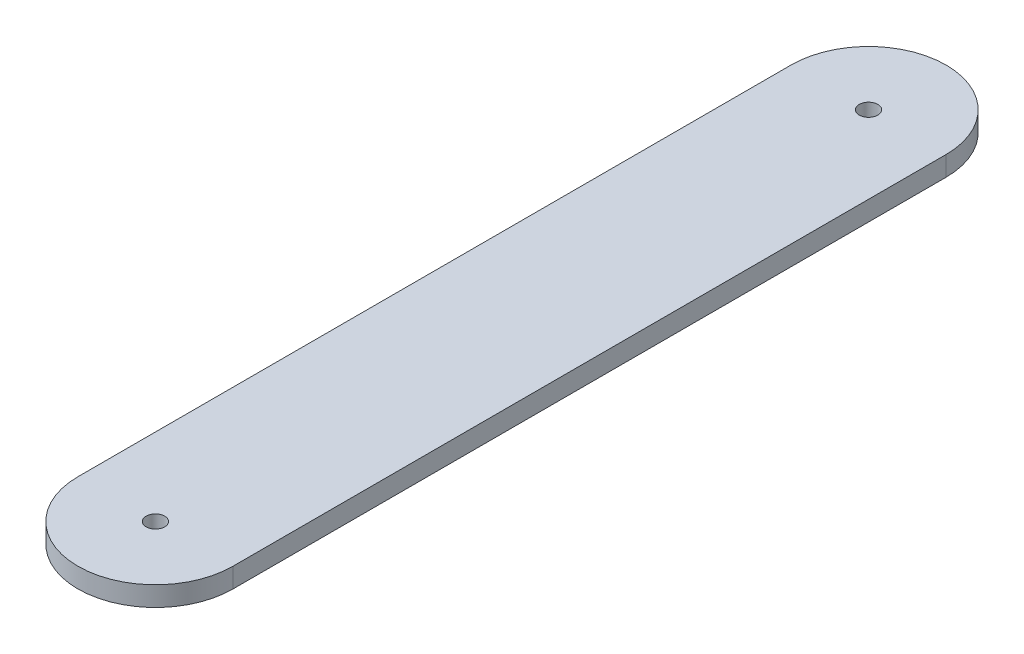
ISO-10303-21;
HEADER;
FILE_DESCRIPTION(('STEP AP214'),'2;1');
FILE_NAME('part.step','',(''),(''),'','','');
FILE_SCHEMA(('AUTOMOTIVE_DESIGN { 1 0 10303 214 1 1 1 1 }'));
ENDSEC;
DATA;
#1=APPLICATION_CONTEXT('core data for automotive mechanical design processes');
#2=APPLICATION_PROTOCOL_DEFINITION('international standard','automotive_design',2000,#1);
#3=PRODUCT_CONTEXT('',#1,'mechanical');
#4=PRODUCT('Part','Part','',(#3));
#5=PRODUCT_RELATED_PRODUCT_CATEGORY('part','',(#4));
#6=PRODUCT_DEFINITION_FORMATION('','',#4);
#7=PRODUCT_DEFINITION_CONTEXT('part definition',#1,'design');
#8=PRODUCT_DEFINITION('design','',#6,#7);
#9=PRODUCT_DEFINITION_SHAPE('','',#8);
#10=(LENGTH_UNIT() NAMED_UNIT(*) SI_UNIT(.MILLI.,.METRE.));
#11=(NAMED_UNIT(*) PLANE_ANGLE_UNIT() SI_UNIT($,.RADIAN.));
#12=(NAMED_UNIT(*) SI_UNIT($,.STERADIAN.) SOLID_ANGLE_UNIT());
#13=UNCERTAINTY_MEASURE_WITH_UNIT(LENGTH_MEASURE(1.E-05),#10,'distance_accuracy_value','');
#14=(GEOMETRIC_REPRESENTATION_CONTEXT(3) GLOBAL_UNCERTAINTY_ASSIGNED_CONTEXT((#13)) GLOBAL_UNIT_ASSIGNED_CONTEXT((#10,
#11,#12)) REPRESENTATION_CONTEXT('',''));
#15=CARTESIAN_POINT('',(0.,0.,0.));
#16=DIRECTION('',(0.,0.,1.));
#17=DIRECTION('',(1.,0.,0.));
#18=AXIS2_PLACEMENT_3D('',#15,#16,#17);
#19=CARTESIAN_POINT('',(0.,3.18,0.));
#20=DIRECTION('',(0.,-1.,0.));
#21=DIRECTION('',(0.,0.,-1.));
#22=AXIS2_PLACEMENT_3D('',#19,#20,#21);
#23=PLANE('',#22);
#24=CARTESIAN_POINT('',(0.,3.18,0.));
#25=DIRECTION('',(0.,1.,0.));
#26=DIRECTION('',(0.,0.,-1.));
#27=AXIS2_PLACEMENT_3D('',#24,#25,#26);
#28=CIRCLE('',#27,12.5);
#29=CARTESIAN_POINT('',(-12.5,3.18,0.));
#30=VERTEX_POINT('',#29);
#31=CARTESIAN_POINT('',(12.5,3.18,0.));
#32=VERTEX_POINT('',#31);
#33=EDGE_CURVE('E85',#30,#32,#28,.T.);
#34=ORIENTED_EDGE('',*,*,#33,.T.);
#35=DIRECTION('',(0.,0.,-1.));
#36=VECTOR('',#35,1.);
#37=CARTESIAN_POINT('',(12.5,3.18,0.));
#38=LINE('',#37,#36);
#39=CARTESIAN_POINT('',(12.5,3.18,-115.));
#40=VERTEX_POINT('',#39);
#41=EDGE_CURVE('E80',#32,#40,#38,.T.);
#42=ORIENTED_EDGE('',*,*,#41,.T.);
#43=CARTESIAN_POINT('',(0.,3.18,-115.));
#44=DIRECTION('',(0.,1.,0.));
#45=DIRECTION('',(0.,0.,-1.));
#46=AXIS2_PLACEMENT_3D('',#43,#44,#45);
#47=CIRCLE('',#46,12.5);
#48=CARTESIAN_POINT('',(-12.5,3.18,-115.));
#49=VERTEX_POINT('',#48);
#50=EDGE_CURVE('E83',#40,#49,#47,.T.);
#51=ORIENTED_EDGE('',*,*,#50,.T.);
#52=DIRECTION('',(0.,0.,1.));
#53=VECTOR('',#52,1.);
#54=CARTESIAN_POINT('',(-12.5,3.18,0.));
#55=LINE('',#54,#53);
#56=EDGE_CURVE('E50',#49,#30,#55,.T.);
#57=ORIENTED_EDGE('',*,*,#56,.T.);
#58=EDGE_LOOP('',(#34,#42,#51,#57));
#59=FACE_BOUND('',#58,.T.);
#60=CARTESIAN_POINT('',(0.,3.18,-115.));
#61=DIRECTION('',(0.,1.,0.));
#62=DIRECTION('',(0.,0.,1.));
#63=AXIS2_PLACEMENT_3D('',#60,#61,#62);
#64=CIRCLE('',#63,1.5);
#65=CARTESIAN_POINT('',(0.,3.18,-116.5));
#66=VERTEX_POINT('',#65);
#67=EDGE_CURVE('E100',#66,#66,#64,.T.);
#68=ORIENTED_EDGE('',*,*,#67,.F.);
#69=EDGE_LOOP('',(#68));
#70=FACE_BOUND('',#69,.T.);
#71=CARTESIAN_POINT('',(0.,3.18,0.));
#72=DIRECTION('',(0.,1.,0.));
#73=DIRECTION('',(0.,0.,1.));
#74=AXIS2_PLACEMENT_3D('',#71,#72,#73);
#75=CIRCLE('',#74,1.5);
#76=CARTESIAN_POINT('',(0.,3.18,-1.5));
#77=VERTEX_POINT('',#76);
#78=EDGE_CURVE('E115',#77,#77,#75,.T.);
#79=ORIENTED_EDGE('',*,*,#78,.F.);
#80=EDGE_LOOP('',(#79));
#81=FACE_BOUND('',#80,.T.);
#82=ADVANCED_FACE('F33',(#59,#70,#81),#23,.F.);
#83=CARTESIAN_POINT('',(0.,0.,0.));
#84=DIRECTION('',(0.,-1.,0.));
#85=DIRECTION('',(0.,0.,-1.));
#86=AXIS2_PLACEMENT_3D('',#83,#84,#85);
#87=PLANE('',#86);
#88=CARTESIAN_POINT('',(0.,0.,-115.));
#89=DIRECTION('',(0.,1.,0.));
#90=DIRECTION('',(0.,0.,1.));
#91=AXIS2_PLACEMENT_3D('',#88,#89,#90);
#92=CIRCLE('',#91,1.5);
#93=CARTESIAN_POINT('',(0.,0.,-116.5));
#94=VERTEX_POINT('',#93);
#95=EDGE_CURVE('E112',#94,#94,#92,.T.);
#96=ORIENTED_EDGE('',*,*,#95,.T.);
#97=EDGE_LOOP('',(#96));
#98=FACE_BOUND('',#97,.T.);
#99=CARTESIAN_POINT('',(0.,0.,0.));
#100=DIRECTION('',(0.,1.,0.));
#101=DIRECTION('',(0.,0.,-1.));
#102=AXIS2_PLACEMENT_3D('',#99,#100,#101);
#103=CIRCLE('',#102,12.5);
#104=CARTESIAN_POINT('',(-12.5,0.,0.));
#105=VERTEX_POINT('',#104);
#106=CARTESIAN_POINT('',(12.5,0.,0.));
#107=VERTEX_POINT('',#106);
#108=EDGE_CURVE('E97',#105,#107,#103,.T.);
#109=ORIENTED_EDGE('',*,*,#108,.F.);
#110=DIRECTION('',(0.,0.,1.));
#111=VECTOR('',#110,1.);
#112=CARTESIAN_POINT('',(-12.5,0.,0.));
#113=LINE('',#112,#111);
#114=CARTESIAN_POINT('',(-12.5,0.,-115.));
#115=VERTEX_POINT('',#114);
#116=EDGE_CURVE('E73',#115,#105,#113,.T.);
#117=ORIENTED_EDGE('',*,*,#116,.F.);
#118=CARTESIAN_POINT('',(0.,0.,-115.));
#119=DIRECTION('',(0.,1.,0.));
#120=DIRECTION('',(0.,0.,-1.));
#121=AXIS2_PLACEMENT_3D('',#118,#119,#120);
#122=CIRCLE('',#121,12.5);
#123=CARTESIAN_POINT('',(12.5,0.,-115.));
#124=VERTEX_POINT('',#123);
#125=EDGE_CURVE('E67',#124,#115,#122,.T.);
#126=ORIENTED_EDGE('',*,*,#125,.F.);
#127=DIRECTION('',(0.,0.,-1.));
#128=VECTOR('',#127,1.);
#129=CARTESIAN_POINT('',(12.5,0.,0.));
#130=LINE('',#129,#128);
#131=EDGE_CURVE('E89',#107,#124,#130,.T.);
#132=ORIENTED_EDGE('',*,*,#131,.F.);
#133=EDGE_LOOP('',(#109,#117,#126,#132));
#134=FACE_BOUND('',#133,.T.);
#135=CARTESIAN_POINT('',(0.,0.,0.));
#136=DIRECTION('',(0.,1.,0.));
#137=DIRECTION('',(0.,0.,1.));
#138=AXIS2_PLACEMENT_3D('',#135,#136,#137);
#139=CIRCLE('',#138,1.5);
#140=CARTESIAN_POINT('',(0.,0.,-1.5));
#141=VERTEX_POINT('',#140);
#142=EDGE_CURVE('E118',#141,#141,#139,.T.);
#143=ORIENTED_EDGE('',*,*,#142,.T.);
#144=EDGE_LOOP('',(#143));
#145=FACE_BOUND('',#144,.T.);
#146=ADVANCED_FACE('F108',(#98,#134,#145),#87,.T.);
#147=CARTESIAN_POINT('',(0.,3.18,0.));
#148=DIRECTION('',(0.,-1.,0.));
#149=DIRECTION('',(0.,0.,-1.));
#150=AXIS2_PLACEMENT_3D('',#147,#148,#149);
#151=CYLINDRICAL_SURFACE('',#150,12.5);
#152=ORIENTED_EDGE('',*,*,#108,.T.);
#153=DIRECTION('',(0.,-1.,0.));
#154=VECTOR('',#153,1.);
#155=CARTESIAN_POINT('',(12.5,3.18,0.));
#156=LINE('',#155,#154);
#157=EDGE_CURVE('E11',#32,#107,#156,.T.);
#158=ORIENTED_EDGE('',*,*,#157,.F.);
#159=ORIENTED_EDGE('',*,*,#33,.F.);
#160=DIRECTION('',(0.,-1.,0.));
#161=VECTOR('',#160,1.);
#162=CARTESIAN_POINT('',(-12.5,3.18,0.));
#163=LINE('',#162,#161);
#164=EDGE_CURVE('E93',#30,#105,#163,.T.);
#165=ORIENTED_EDGE('',*,*,#164,.T.);
#166=EDGE_LOOP('',(#152,#158,#159,#165));
#167=FACE_BOUND('',#166,.T.);
#168=ADVANCED_FACE('F35',(#167),#151,.T.);
#169=CARTESIAN_POINT('',(12.5,3.18,0.));
#170=DIRECTION('',(-1.,0.,0.));
#171=DIRECTION('',(0.,0.,1.));
#172=AXIS2_PLACEMENT_3D('',#169,#170,#171);
#173=PLANE('',#172);
#174=ORIENTED_EDGE('',*,*,#131,.T.);
#175=DIRECTION('',(0.,-1.,0.));
#176=VECTOR('',#175,1.);
#177=CARTESIAN_POINT('',(12.5,3.18,-115.));
#178=LINE('',#177,#176);
#179=EDGE_CURVE('E42',#40,#124,#178,.T.);
#180=ORIENTED_EDGE('',*,*,#179,.F.);
#181=ORIENTED_EDGE('',*,*,#41,.F.);
#182=ORIENTED_EDGE('',*,*,#157,.T.);
#183=EDGE_LOOP('',(#174,#180,#181,#182));
#184=FACE_BOUND('',#183,.T.);
#185=ADVANCED_FACE('F88',(#184),#173,.F.);
#186=CARTESIAN_POINT('',(0.,3.18,-115.));
#187=DIRECTION('',(0.,-1.,0.));
#188=DIRECTION('',(0.,0.,-1.));
#189=AXIS2_PLACEMENT_3D('',#186,#187,#188);
#190=CYLINDRICAL_SURFACE('',#189,12.5);
#191=ORIENTED_EDGE('',*,*,#125,.T.);
#192=DIRECTION('',(0.,-1.,0.));
#193=VECTOR('',#192,1.);
#194=CARTESIAN_POINT('',(-12.5,3.18,-115.));
#195=LINE('',#194,#193);
#196=EDGE_CURVE('E90',#49,#115,#195,.T.);
#197=ORIENTED_EDGE('',*,*,#196,.F.);
#198=ORIENTED_EDGE('',*,*,#50,.F.);
#199=ORIENTED_EDGE('',*,*,#179,.T.);
#200=EDGE_LOOP('',(#191,#197,#198,#199));
#201=FACE_BOUND('',#200,.T.);
#202=ADVANCED_FACE('F91',(#201),#190,.T.);
#203=CARTESIAN_POINT('',(-12.5,3.18,0.));
#204=DIRECTION('',(1.,0.,0.));
#205=DIRECTION('',(0.,0.,-1.));
#206=AXIS2_PLACEMENT_3D('',#203,#204,#205);
#207=PLANE('',#206);
#208=ORIENTED_EDGE('',*,*,#116,.T.);
#209=ORIENTED_EDGE('',*,*,#164,.F.);
#210=ORIENTED_EDGE('',*,*,#56,.F.);
#211=ORIENTED_EDGE('',*,*,#196,.T.);
#212=EDGE_LOOP('',(#208,#209,#210,#211));
#213=FACE_BOUND('',#212,.T.);
#214=ADVANCED_FACE('F105',(#213),#207,.F.);
#215=CARTESIAN_POINT('',(0.,3.18,-115.));
#216=DIRECTION('',(0.,-1.,0.));
#217=DIRECTION('',(0.,0.,-1.));
#218=AXIS2_PLACEMENT_3D('',#215,#216,#217);
#219=CYLINDRICAL_SURFACE('',#218,1.5);
#220=CARTESIAN_POINT('',(0.,3.18,-116.5));
#221=CARTESIAN_POINT('',(0.,3.146875,-116.5));
#222=CARTESIAN_POINT('',(0.,3.11375,-116.5));
#223=CARTESIAN_POINT('',(0.,3.0475,-116.5));
#224=CARTESIAN_POINT('',(0.,3.014375,-116.5));
#225=CARTESIAN_POINT('',(0.,2.948125,-116.5));
#226=CARTESIAN_POINT('',(0.,2.915,-116.5));
#227=CARTESIAN_POINT('',(0.,2.84875,-116.5));
#228=CARTESIAN_POINT('',(0.,2.815625,-116.5));
#229=CARTESIAN_POINT('',(0.,2.749375,-116.5));
#230=CARTESIAN_POINT('',(0.,2.71625,-116.5));
#231=CARTESIAN_POINT('',(0.,2.65,-116.5));
#232=CARTESIAN_POINT('',(0.,2.616875,-116.5));
#233=CARTESIAN_POINT('',(0.,2.550625,-116.5));
#234=CARTESIAN_POINT('',(0.,2.5175,-116.5));
#235=CARTESIAN_POINT('',(0.,2.45125,-116.5));
#236=CARTESIAN_POINT('',(0.,2.418125,-116.5));
#237=CARTESIAN_POINT('',(0.,2.351875,-116.5));
#238=CARTESIAN_POINT('',(0.,2.31875,-116.5));
#239=CARTESIAN_POINT('',(0.,2.2525,-116.5));
#240=CARTESIAN_POINT('',(0.,2.219375,-116.5));
#241=CARTESIAN_POINT('',(0.,2.153125,-116.5));
#242=CARTESIAN_POINT('',(0.,2.12,-116.5));
#243=CARTESIAN_POINT('',(0.,2.05375,-116.5));
#244=CARTESIAN_POINT('',(0.,2.020625,-116.5));
#245=CARTESIAN_POINT('',(0.,1.954375,-116.5));
#246=CARTESIAN_POINT('',(0.,1.92125,-116.5));
#247=CARTESIAN_POINT('',(0.,1.855,-116.5));
#248=CARTESIAN_POINT('',(0.,1.821875,-116.5));
#249=CARTESIAN_POINT('',(0.,1.755625,-116.5));
#250=CARTESIAN_POINT('',(0.,1.7225,-116.5));
#251=CARTESIAN_POINT('',(0.,1.65625,-116.5));
#252=CARTESIAN_POINT('',(0.,1.623125,-116.5));
#253=CARTESIAN_POINT('',(0.,1.556875,-116.5));
#254=CARTESIAN_POINT('',(0.,1.52375,-116.5));
#255=CARTESIAN_POINT('',(0.,1.4575,-116.5));
#256=CARTESIAN_POINT('',(0.,1.424375,-116.5));
#257=CARTESIAN_POINT('',(0.,1.358125,-116.5));
#258=CARTESIAN_POINT('',(0.,1.325,-116.5));
#259=CARTESIAN_POINT('',(0.,1.25875,-116.5));
#260=CARTESIAN_POINT('',(0.,1.225625,-116.5));
#261=CARTESIAN_POINT('',(0.,1.159375,-116.5));
#262=CARTESIAN_POINT('',(0.,1.12625,-116.5));
#263=CARTESIAN_POINT('',(0.,1.06,-116.5));
#264=CARTESIAN_POINT('',(0.,1.026875,-116.5));
#265=CARTESIAN_POINT('',(0.,0.960625,-116.5));
#266=CARTESIAN_POINT('',(0.,0.9275,-116.5));
#267=CARTESIAN_POINT('',(0.,0.86125,-116.5));
#268=CARTESIAN_POINT('',(0.,0.828125,-116.5));
#269=CARTESIAN_POINT('',(0.,0.761875,-116.5));
#270=CARTESIAN_POINT('',(0.,0.72875,-116.5));
#271=CARTESIAN_POINT('',(0.,0.6625,-116.5));
#272=CARTESIAN_POINT('',(0.,0.629375,-116.5));
#273=CARTESIAN_POINT('',(0.,0.563125,-116.5));
#274=CARTESIAN_POINT('',(0.,0.53,-116.5));
#275=CARTESIAN_POINT('',(0.,0.46375,-116.5));
#276=CARTESIAN_POINT('',(0.,0.430625,-116.5));
#277=CARTESIAN_POINT('',(0.,0.364375,-116.5));
#278=CARTESIAN_POINT('',(0.,0.33125,-116.5));
#279=CARTESIAN_POINT('',(0.,0.265,-116.5));
#280=CARTESIAN_POINT('',(0.,0.231875,-116.5));
#281=CARTESIAN_POINT('',(0.,0.165625,-116.5));
#282=CARTESIAN_POINT('',(0.,0.1325,-116.5));
#283=CARTESIAN_POINT('',(0.,0.06625,-116.5));
#284=CARTESIAN_POINT('',(0.,0.033125,-116.5));
#285=CARTESIAN_POINT('',(0.,0.,-116.5));
#286=B_SPLINE_CURVE_WITH_KNOTS('',3,(#220,#221,#222,#223,#224,#225,#226,#227,#228,#229,#230,
#231,#232,#233,#234,#235,#236,#237,#238,#239,#240,#241,#242,#243,#244,#245,#246,#247,#248,#249,
#250,#251,#252,#253,#254,#255,#256,#257,#258,#259,#260,#261,#262,#263,#264,#265,#266,#267,#268,
#269,#270,#271,#272,#273,#274,#275,#276,#277,#278,#279,#280,#281,#282,#283,#284,#285),
.UNSPECIFIED.,.F.,.F.,(4,2,2,2,2,2,2,2,2,2,2,2,2,2,2,2,2,2,2,2,2,2,2,2,2,2,2,2,2,2,2,2,4),(0.,
0.0993749999999996,0.19875,0.298125,0.3975,0.496875,0.59625,0.695625,0.795,0.894375,0.99375,
1.093125,1.1925,1.291875,1.39125,1.490625,1.59,1.689375,1.78875,1.888125,1.9875,2.086875,
2.18625,2.285625,2.385,2.484375,2.58375,2.683125,2.7825,2.881875,2.98125,3.080625,3.18),.UNSPECIFIED.);
#287=EDGE_CURVE('BSEAM135',#66,#94,#286,.T.);
#288=ORIENTED_EDGE('',*,*,#67,.T.);
#289=ORIENTED_EDGE('',*,*,#95,.F.);
#290=ORIENTED_EDGE('',*,*,#287,.T.);
#291=ORIENTED_EDGE('',*,*,#287,.F.);
#292=EDGE_LOOP('',(#288,#290,#289,#291));
#293=FACE_BOUND('',#292,.T.);
#294=ADVANCED_FACE('F135',(#293),#219,.F.);
#295=CARTESIAN_POINT('',(0.,3.18,0.));
#296=DIRECTION('',(0.,-1.,0.));
#297=DIRECTION('',(0.,0.,-1.));
#298=AXIS2_PLACEMENT_3D('',#295,#296,#297);
#299=CYLINDRICAL_SURFACE('',#298,1.5);
#300=CARTESIAN_POINT('',(0.,3.18,-1.5));
#301=CARTESIAN_POINT('',(0.,3.146875,-1.5));
#302=CARTESIAN_POINT('',(0.,3.11375,-1.5));
#303=CARTESIAN_POINT('',(0.,3.0475,-1.5));
#304=CARTESIAN_POINT('',(0.,3.014375,-1.5));
#305=CARTESIAN_POINT('',(0.,2.948125,-1.5));
#306=CARTESIAN_POINT('',(0.,2.915,-1.5));
#307=CARTESIAN_POINT('',(0.,2.84875,-1.5));
#308=CARTESIAN_POINT('',(0.,2.815625,-1.5));
#309=CARTESIAN_POINT('',(0.,2.749375,-1.5));
#310=CARTESIAN_POINT('',(0.,2.71625,-1.5));
#311=CARTESIAN_POINT('',(0.,2.65,-1.5));
#312=CARTESIAN_POINT('',(0.,2.616875,-1.5));
#313=CARTESIAN_POINT('',(0.,2.550625,-1.5));
#314=CARTESIAN_POINT('',(0.,2.5175,-1.5));
#315=CARTESIAN_POINT('',(0.,2.45125,-1.5));
#316=CARTESIAN_POINT('',(0.,2.418125,-1.5));
#317=CARTESIAN_POINT('',(0.,2.351875,-1.5));
#318=CARTESIAN_POINT('',(0.,2.31875,-1.5));
#319=CARTESIAN_POINT('',(0.,2.2525,-1.5));
#320=CARTESIAN_POINT('',(0.,2.219375,-1.5));
#321=CARTESIAN_POINT('',(0.,2.153125,-1.5));
#322=CARTESIAN_POINT('',(0.,2.12,-1.5));
#323=CARTESIAN_POINT('',(0.,2.05375,-1.5));
#324=CARTESIAN_POINT('',(0.,2.020625,-1.5));
#325=CARTESIAN_POINT('',(0.,1.954375,-1.5));
#326=CARTESIAN_POINT('',(0.,1.92125,-1.5));
#327=CARTESIAN_POINT('',(0.,1.855,-1.5));
#328=CARTESIAN_POINT('',(0.,1.821875,-1.5));
#329=CARTESIAN_POINT('',(0.,1.755625,-1.5));
#330=CARTESIAN_POINT('',(0.,1.7225,-1.5));
#331=CARTESIAN_POINT('',(0.,1.65625,-1.5));
#332=CARTESIAN_POINT('',(0.,1.623125,-1.5));
#333=CARTESIAN_POINT('',(0.,1.556875,-1.5));
#334=CARTESIAN_POINT('',(0.,1.52375,-1.5));
#335=CARTESIAN_POINT('',(0.,1.4575,-1.5));
#336=CARTESIAN_POINT('',(0.,1.424375,-1.5));
#337=CARTESIAN_POINT('',(0.,1.358125,-1.5));
#338=CARTESIAN_POINT('',(0.,1.325,-1.5));
#339=CARTESIAN_POINT('',(0.,1.25875,-1.5));
#340=CARTESIAN_POINT('',(0.,1.225625,-1.5));
#341=CARTESIAN_POINT('',(0.,1.159375,-1.5));
#342=CARTESIAN_POINT('',(0.,1.12625,-1.5));
#343=CARTESIAN_POINT('',(0.,1.06,-1.5));
#344=CARTESIAN_POINT('',(0.,1.026875,-1.5));
#345=CARTESIAN_POINT('',(0.,0.960625,-1.5));
#346=CARTESIAN_POINT('',(0.,0.9275,-1.5));
#347=CARTESIAN_POINT('',(0.,0.86125,-1.5));
#348=CARTESIAN_POINT('',(0.,0.828125,-1.5));
#349=CARTESIAN_POINT('',(0.,0.761875,-1.5));
#350=CARTESIAN_POINT('',(0.,0.72875,-1.5));
#351=CARTESIAN_POINT('',(0.,0.6625,-1.5));
#352=CARTESIAN_POINT('',(0.,0.629375,-1.5));
#353=CARTESIAN_POINT('',(0.,0.563125,-1.5));
#354=CARTESIAN_POINT('',(0.,0.53,-1.5));
#355=CARTESIAN_POINT('',(0.,0.46375,-1.5));
#356=CARTESIAN_POINT('',(0.,0.430625,-1.5));
#357=CARTESIAN_POINT('',(0.,0.364375,-1.5));
#358=CARTESIAN_POINT('',(0.,0.33125,-1.5));
#359=CARTESIAN_POINT('',(0.,0.265,-1.5));
#360=CARTESIAN_POINT('',(0.,0.231875,-1.5));
#361=CARTESIAN_POINT('',(0.,0.165625,-1.5));
#362=CARTESIAN_POINT('',(0.,0.1325,-1.5));
#363=CARTESIAN_POINT('',(0.,0.06625,-1.5));
#364=CARTESIAN_POINT('',(0.,0.033125,-1.5));
#365=CARTESIAN_POINT('',(0.,0.,-1.5));
#366=B_SPLINE_CURVE_WITH_KNOTS('',3,(#300,#301,#302,#303,#304,#305,#306,#307,#308,#309,#310,
#311,#312,#313,#314,#315,#316,#317,#318,#319,#320,#321,#322,#323,#324,#325,#326,#327,#328,#329,
#330,#331,#332,#333,#334,#335,#336,#337,#338,#339,#340,#341,#342,#343,#344,#345,#346,#347,#348,
#349,#350,#351,#352,#353,#354,#355,#356,#357,#358,#359,#360,#361,#362,#363,#364,#365),
.UNSPECIFIED.,.F.,.F.,(4,2,2,2,2,2,2,2,2,2,2,2,2,2,2,2,2,2,2,2,2,2,2,2,2,2,2,2,2,2,2,2,4),(0.,
0.0993749999999996,0.19875,0.298125,0.3975,0.496875,0.59625,0.695625,0.795,0.894375,0.99375,
1.093125,1.1925,1.291875,1.39125,1.490625,1.59,1.689375,1.78875,1.888125,1.9875,2.086875,
2.18625,2.285625,2.385,2.484375,2.58375,2.683125,2.7825,2.881875,2.98125,3.080625,3.18),.UNSPECIFIED.);
#367=EDGE_CURVE('BSEAM124',#77,#141,#366,.T.);
#368=ORIENTED_EDGE('',*,*,#78,.T.);
#369=ORIENTED_EDGE('',*,*,#142,.F.);
#370=ORIENTED_EDGE('',*,*,#367,.T.);
#371=ORIENTED_EDGE('',*,*,#367,.F.);
#372=EDGE_LOOP('',(#368,#370,#369,#371));
#373=FACE_BOUND('',#372,.T.);
#374=ADVANCED_FACE('F124',(#373),#299,.F.);
#375=CLOSED_SHELL('',(#82,#146,#168,#185,#202,#214,#294,#374));
#376=MANIFOLD_SOLID_BREP('B2',#375);
#377=ADVANCED_BREP_SHAPE_REPRESENTATION('',(#18,#376),#14);
#378=SHAPE_DEFINITION_REPRESENTATION(#9,#377);
ENDSEC;
END-ISO-10303-21;
